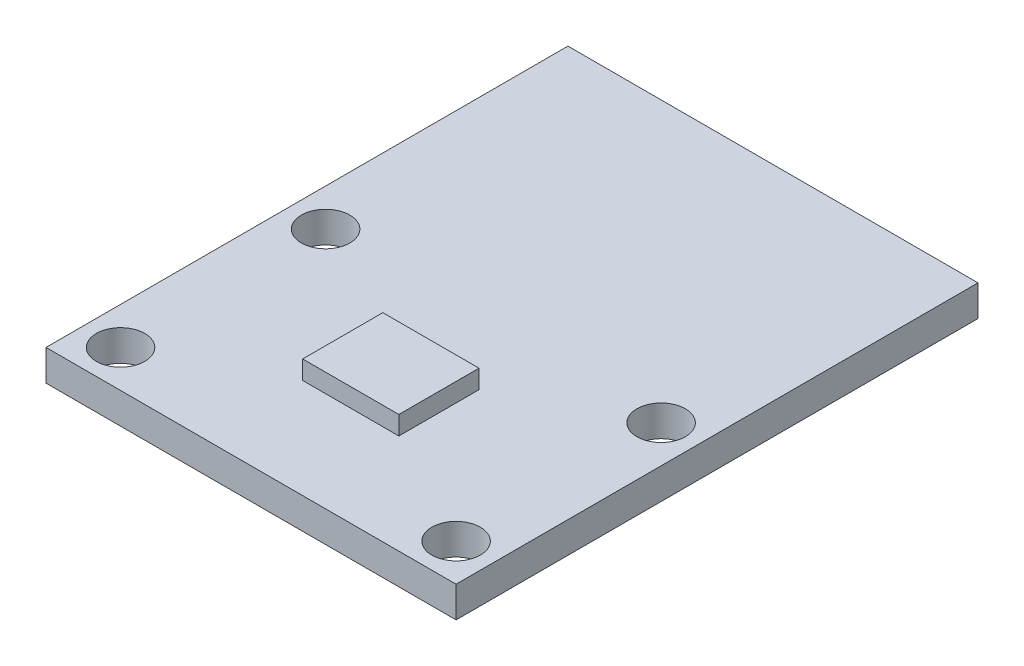
ISO-10303-21;
HEADER;
FILE_DESCRIPTION(('STEP AP214'),'2;1');
FILE_NAME('part.step','',(''),(''),'','','');
FILE_SCHEMA(('AUTOMOTIVE_DESIGN { 1 0 10303 214 1 1 1 1 }'));
ENDSEC;
DATA;
#1=APPLICATION_CONTEXT('core data for automotive mechanical design processes');
#2=APPLICATION_PROTOCOL_DEFINITION('international standard','automotive_design',2000,#1);
#3=PRODUCT_CONTEXT('',#1,'mechanical');
#4=PRODUCT('Part','Part','',(#3));
#5=PRODUCT_RELATED_PRODUCT_CATEGORY('part','',(#4));
#6=PRODUCT_DEFINITION_FORMATION('','',#4);
#7=PRODUCT_DEFINITION_CONTEXT('part definition',#1,'design');
#8=PRODUCT_DEFINITION('design','',#6,#7);
#9=PRODUCT_DEFINITION_SHAPE('','',#8);
#10=(LENGTH_UNIT() NAMED_UNIT(*) SI_UNIT(.MILLI.,.METRE.));
#11=(NAMED_UNIT(*) PLANE_ANGLE_UNIT() SI_UNIT($,.RADIAN.));
#12=(NAMED_UNIT(*) SI_UNIT($,.STERADIAN.) SOLID_ANGLE_UNIT());
#13=UNCERTAINTY_MEASURE_WITH_UNIT(LENGTH_MEASURE(1.E-05),#10,'distance_accuracy_value','');
#14=(GEOMETRIC_REPRESENTATION_CONTEXT(3) GLOBAL_UNCERTAINTY_ASSIGNED_CONTEXT((#13)) GLOBAL_UNIT_ASSIGNED_CONTEXT((#10,
#11,#12)) REPRESENTATION_CONTEXT('',''));
#15=CARTESIAN_POINT('',(0.,0.,0.));
#16=DIRECTION('',(0.,0.,1.));
#17=DIRECTION('',(1.,0.,0.));
#18=AXIS2_PLACEMENT_3D('',#15,#16,#17);
#19=CARTESIAN_POINT('',(0.,0.83,0.));
#20=DIRECTION('',(0.,1.,0.));
#21=DIRECTION('',(0.,0.,1.));
#22=AXIS2_PLACEMENT_3D('',#19,#20,#21);
#23=PLANE('',#22);
#24=CARTESIAN_POINT('',(-8.99999999999999,0.83,12.));
#25=DIRECTION('',(0.,1.,0.));
#26=DIRECTION('',(0.,0.,1.));
#27=AXIS2_PLACEMENT_3D('',#24,#25,#26);
#28=CIRCLE('',#27,1.3);
#29=CARTESIAN_POINT('',(-8.99999999999999,0.83,10.7));
#30=VERTEX_POINT('',#29);
#31=EDGE_CURVE('E146',#30,#30,#28,.T.);
#32=ORIENTED_EDGE('',*,*,#31,.F.);
#33=EDGE_LOOP('',(#32));
#34=FACE_BOUND('',#33,.T.);
#35=CARTESIAN_POINT('',(-9.,0.83,1.));
#36=DIRECTION('',(0.,1.,0.));
#37=DIRECTION('',(0.,0.,1.));
#38=AXIS2_PLACEMENT_3D('',#35,#36,#37);
#39=CIRCLE('',#38,1.3);
#40=CARTESIAN_POINT('',(-9.,0.83,-0.299999999999995));
#41=VERTEX_POINT('',#40);
#42=EDGE_CURVE('E158',#41,#41,#39,.T.);
#43=ORIENTED_EDGE('',*,*,#42,.F.);
#44=EDGE_LOOP('',(#43));
#45=FACE_BOUND('',#44,.T.);
#46=DIRECTION('',(0.,0.,-1.));
#47=VECTOR('',#46,1.);
#48=CARTESIAN_POINT('',(11.,0.83,-14.));
#49=LINE('',#48,#47);
#50=CARTESIAN_POINT('',(11.,0.83,14.));
#51=VERTEX_POINT('',#50);
#52=CARTESIAN_POINT('',(11.,0.83,-14.));
#53=VERTEX_POINT('',#52);
#54=EDGE_CURVE('E164',#51,#53,#49,.T.);
#55=ORIENTED_EDGE('',*,*,#54,.T.);
#56=DIRECTION('',(-1.,0.,0.));
#57=VECTOR('',#56,1.);
#58=CARTESIAN_POINT('',(-11.,0.83,-14.));
#59=LINE('',#58,#57);
#60=CARTESIAN_POINT('',(-11.,0.83,-14.));
#61=VERTEX_POINT('',#60);
#62=EDGE_CURVE('E88',#53,#61,#59,.T.);
#63=ORIENTED_EDGE('',*,*,#62,.T.);
#64=DIRECTION('',(0.,0.,1.));
#65=VECTOR('',#64,1.);
#66=CARTESIAN_POINT('',(-11.,0.83,-14.));
#67=LINE('',#66,#65);
#68=CARTESIAN_POINT('',(-11.,0.83,14.));
#69=VERTEX_POINT('',#68);
#70=EDGE_CURVE('E167',#61,#69,#67,.T.);
#71=ORIENTED_EDGE('',*,*,#70,.T.);
#72=DIRECTION('',(1.,0.,0.));
#73=VECTOR('',#72,1.);
#74=CARTESIAN_POINT('',(-11.,0.83,14.));
#75=LINE('',#74,#73);
#76=EDGE_CURVE('E60',#69,#51,#75,.T.);
#77=ORIENTED_EDGE('',*,*,#76,.T.);
#78=EDGE_LOOP('',(#55,#63,#71,#77));
#79=FACE_BOUND('',#78,.T.);
#80=CARTESIAN_POINT('',(9.,0.83,1.));
#81=DIRECTION('',(0.,1.,0.));
#82=DIRECTION('',(0.,0.,1.));
#83=AXIS2_PLACEMENT_3D('',#80,#81,#82);
#84=CIRCLE('',#83,1.3);
#85=CARTESIAN_POINT('',(9.,0.83,-0.299999999999997));
#86=VERTEX_POINT('',#85);
#87=EDGE_CURVE('E152',#86,#86,#84,.T.);
#88=ORIENTED_EDGE('',*,*,#87,.F.);
#89=EDGE_LOOP('',(#88));
#90=FACE_BOUND('',#89,.T.);
#91=CARTESIAN_POINT('',(9.,0.83,12.));
#92=DIRECTION('',(0.,1.,0.));
#93=DIRECTION('',(0.,0.,1.));
#94=AXIS2_PLACEMENT_3D('',#91,#92,#93);
#95=CIRCLE('',#94,1.3);
#96=CARTESIAN_POINT('',(9.,0.83,10.7));
#97=VERTEX_POINT('',#96);
#98=EDGE_CURVE('E138',#97,#97,#95,.T.);
#99=ORIENTED_EDGE('',*,*,#98,.F.);
#100=EDGE_LOOP('',(#99));
#101=FACE_BOUND('',#100,.T.);
#102=DIRECTION('',(-1.,0.,0.));
#103=VECTOR('',#102,1.);
#104=CARTESIAN_POINT('',(-2.58,0.83,4.35));
#105=LINE('',#104,#103);
#106=CARTESIAN_POINT('',(2.58,0.83,4.35));
#107=VERTEX_POINT('',#106);
#108=CARTESIAN_POINT('',(-2.58,0.83,4.35));
#109=VERTEX_POINT('',#108);
#110=EDGE_CURVE('E357',#107,#109,#105,.T.);
#111=ORIENTED_EDGE('',*,*,#110,.F.);
#112=DIRECTION('',(0.,0.,-1.));
#113=VECTOR('',#112,1.);
#114=CARTESIAN_POINT('',(2.58,0.83,4.35));
#115=LINE('',#114,#113);
#116=CARTESIAN_POINT('',(2.58,0.83,8.65));
#117=VERTEX_POINT('',#116);
#118=EDGE_CURVE('E133',#117,#107,#115,.T.);
#119=ORIENTED_EDGE('',*,*,#118,.F.);
#120=DIRECTION('',(1.,0.,0.));
#121=VECTOR('',#120,1.);
#122=CARTESIAN_POINT('',(-2.58,0.83,8.65));
#123=LINE('',#122,#121);
#124=CARTESIAN_POINT('',(-2.58,0.83,8.65));
#125=VERTEX_POINT('',#124);
#126=EDGE_CURVE('E129',#125,#117,#123,.T.);
#127=ORIENTED_EDGE('',*,*,#126,.F.);
#128=DIRECTION('',(0.,0.,1.));
#129=VECTOR('',#128,1.);
#130=CARTESIAN_POINT('',(-2.58,0.83,4.35));
#131=LINE('',#130,#129);
#132=EDGE_CURVE('E354',#109,#125,#131,.T.);
#133=ORIENTED_EDGE('',*,*,#132,.F.);
#134=EDGE_LOOP('',(#111,#119,#127,#133));
#135=FACE_BOUND('',#134,.T.);
#136=ADVANCED_FACE('F36',(#34,#45,#79,#90,#101,#135),#23,.T.);
#137=CARTESIAN_POINT('',(0.,-0.83,0.));
#138=DIRECTION('',(0.,1.,0.));
#139=DIRECTION('',(0.,0.,1.));
#140=AXIS2_PLACEMENT_3D('',#137,#138,#139);
#141=PLANE('',#140);
#142=DIRECTION('',(0.,0.,-1.));
#143=VECTOR('',#142,1.);
#144=CARTESIAN_POINT('',(11.,-0.83,-14.));
#145=LINE('',#144,#143);
#146=CARTESIAN_POINT('',(11.,-0.83,14.));
#147=VERTEX_POINT('',#146);
#148=CARTESIAN_POINT('',(11.,-0.83,-14.));
#149=VERTEX_POINT('',#148);
#150=EDGE_CURVE('E161',#147,#149,#145,.T.);
#151=ORIENTED_EDGE('',*,*,#150,.F.);
#152=DIRECTION('',(1.,0.,0.));
#153=VECTOR('',#152,1.);
#154=CARTESIAN_POINT('',(-11.,-0.83,14.));
#155=LINE('',#154,#153);
#156=CARTESIAN_POINT('',(-11.,-0.83,14.));
#157=VERTEX_POINT('',#156);
#158=EDGE_CURVE('E81',#157,#147,#155,.T.);
#159=ORIENTED_EDGE('',*,*,#158,.F.);
#160=DIRECTION('',(0.,0.,1.));
#161=VECTOR('',#160,1.);
#162=CARTESIAN_POINT('',(-11.,-0.83,-14.));
#163=LINE('',#162,#161);
#164=CARTESIAN_POINT('',(-11.,-0.83,-14.));
#165=VERTEX_POINT('',#164);
#166=EDGE_CURVE('E175',#165,#157,#163,.T.);
#167=ORIENTED_EDGE('',*,*,#166,.F.);
#168=DIRECTION('',(-1.,0.,0.));
#169=VECTOR('',#168,1.);
#170=CARTESIAN_POINT('',(-11.,-0.83,-14.));
#171=LINE('',#170,#169);
#172=EDGE_CURVE('E173',#149,#165,#171,.T.);
#173=ORIENTED_EDGE('',*,*,#172,.F.);
#174=EDGE_LOOP('',(#151,#159,#167,#173));
#175=FACE_BOUND('',#174,.T.);
#176=CARTESIAN_POINT('',(-9.,-0.83,1.));
#177=DIRECTION('',(0.,1.,0.));
#178=DIRECTION('',(0.,0.,1.));
#179=AXIS2_PLACEMENT_3D('',#176,#177,#178);
#180=CIRCLE('',#179,1.3);
#181=CARTESIAN_POINT('',(-9.,-0.83,-0.299999999999995));
#182=VERTEX_POINT('',#181);
#183=EDGE_CURVE('E155',#182,#182,#180,.T.);
#184=ORIENTED_EDGE('',*,*,#183,.T.);
#185=EDGE_LOOP('',(#184));
#186=FACE_BOUND('',#185,.T.);
#187=CARTESIAN_POINT('',(9.,-0.83,1.));
#188=DIRECTION('',(0.,1.,0.));
#189=DIRECTION('',(0.,0.,1.));
#190=AXIS2_PLACEMENT_3D('',#187,#188,#189);
#191=CIRCLE('',#190,1.3);
#192=CARTESIAN_POINT('',(9.,-0.83,-0.299999999999997));
#193=VERTEX_POINT('',#192);
#194=EDGE_CURVE('E149',#193,#193,#191,.T.);
#195=ORIENTED_EDGE('',*,*,#194,.T.);
#196=EDGE_LOOP('',(#195));
#197=FACE_BOUND('',#196,.T.);
#198=CARTESIAN_POINT('',(-8.99999999999999,-0.83,12.));
#199=DIRECTION('',(0.,1.,0.));
#200=DIRECTION('',(0.,0.,1.));
#201=AXIS2_PLACEMENT_3D('',#198,#199,#200);
#202=CIRCLE('',#201,1.3);
#203=CARTESIAN_POINT('',(-8.99999999999999,-0.83,10.7));
#204=VERTEX_POINT('',#203);
#205=EDGE_CURVE('E144',#204,#204,#202,.T.);
#206=ORIENTED_EDGE('',*,*,#205,.T.);
#207=EDGE_LOOP('',(#206));
#208=FACE_BOUND('',#207,.T.);
#209=CARTESIAN_POINT('',(9.,-0.83,12.));
#210=DIRECTION('',(0.,1.,0.));
#211=DIRECTION('',(0.,0.,1.));
#212=AXIS2_PLACEMENT_3D('',#209,#210,#211);
#213=CIRCLE('',#212,1.3);
#214=CARTESIAN_POINT('',(9.,-0.83,10.7));
#215=VERTEX_POINT('',#214);
#216=EDGE_CURVE('E135',#215,#215,#213,.T.);
#217=ORIENTED_EDGE('',*,*,#216,.T.);
#218=EDGE_LOOP('',(#217));
#219=FACE_BOUND('',#218,.T.);
#220=ADVANCED_FACE('F188',(#175,#186,#197,#208,#219),#141,.F.);
#221=CARTESIAN_POINT('',(11.,0.83,-14.));
#222=DIRECTION('',(-1.,0.,0.));
#223=DIRECTION('',(0.,0.,1.));
#224=AXIS2_PLACEMENT_3D('',#221,#222,#223);
#225=PLANE('',#224);
#226=ORIENTED_EDGE('',*,*,#150,.T.);
#227=DIRECTION('',(0.,-1.,0.));
#228=VECTOR('',#227,1.);
#229=CARTESIAN_POINT('',(11.,0.83,-14.));
#230=LINE('',#229,#228);
#231=EDGE_CURVE('E11',#53,#149,#230,.T.);
#232=ORIENTED_EDGE('',*,*,#231,.F.);
#233=ORIENTED_EDGE('',*,*,#54,.F.);
#234=DIRECTION('',(0.,-1.,0.));
#235=VECTOR('',#234,1.);
#236=CARTESIAN_POINT('',(11.,0.83,14.));
#237=LINE('',#236,#235);
#238=EDGE_CURVE('E170',#51,#147,#237,.T.);
#239=ORIENTED_EDGE('',*,*,#238,.T.);
#240=EDGE_LOOP('',(#226,#232,#233,#239));
#241=FACE_BOUND('',#240,.T.);
#242=ADVANCED_FACE('F38',(#241),#225,.F.);
#243=CARTESIAN_POINT('',(-11.,0.83,-14.));
#244=DIRECTION('',(0.,0.,1.));
#245=DIRECTION('',(1.,0.,0.));
#246=AXIS2_PLACEMENT_3D('',#243,#244,#245);
#247=PLANE('',#246);
#248=ORIENTED_EDGE('',*,*,#172,.T.);
#249=DIRECTION('',(0.,-1.,0.));
#250=VECTOR('',#249,1.);
#251=CARTESIAN_POINT('',(-11.,0.83,-14.));
#252=LINE('',#251,#250);
#253=EDGE_CURVE('E44',#61,#165,#252,.T.);
#254=ORIENTED_EDGE('',*,*,#253,.F.);
#255=ORIENTED_EDGE('',*,*,#62,.F.);
#256=ORIENTED_EDGE('',*,*,#231,.T.);
#257=EDGE_LOOP('',(#248,#254,#255,#256));
#258=FACE_BOUND('',#257,.T.);
#259=ADVANCED_FACE('F204',(#258),#247,.F.);
#260=CARTESIAN_POINT('',(-11.,0.83,-14.));
#261=DIRECTION('',(1.,0.,0.));
#262=DIRECTION('',(0.,0.,-1.));
#263=AXIS2_PLACEMENT_3D('',#260,#261,#262);
#264=PLANE('',#263);
#265=ORIENTED_EDGE('',*,*,#166,.T.);
#266=DIRECTION('',(0.,-1.,0.));
#267=VECTOR('',#266,1.);
#268=CARTESIAN_POINT('',(-11.,0.83,14.));
#269=LINE('',#268,#267);
#270=EDGE_CURVE('E179',#69,#157,#269,.T.);
#271=ORIENTED_EDGE('',*,*,#270,.F.);
#272=ORIENTED_EDGE('',*,*,#70,.F.);
#273=ORIENTED_EDGE('',*,*,#253,.T.);
#274=EDGE_LOOP('',(#265,#271,#272,#273));
#275=FACE_BOUND('',#274,.T.);
#276=ADVANCED_FACE('F184',(#275),#264,.F.);
#277=CARTESIAN_POINT('',(-11.,0.83,14.));
#278=DIRECTION('',(0.,0.,-1.));
#279=DIRECTION('',(-1.,0.,0.));
#280=AXIS2_PLACEMENT_3D('',#277,#278,#279);
#281=PLANE('',#280);
#282=ORIENTED_EDGE('',*,*,#158,.T.);
#283=ORIENTED_EDGE('',*,*,#238,.F.);
#284=ORIENTED_EDGE('',*,*,#76,.F.);
#285=ORIENTED_EDGE('',*,*,#270,.T.);
#286=EDGE_LOOP('',(#282,#283,#284,#285));
#287=FACE_BOUND('',#286,.T.);
#288=ADVANCED_FACE('F193',(#287),#281,.F.);
#289=CARTESIAN_POINT('',(-9.,0.83,1.));
#290=DIRECTION('',(0.,-1.,0.));
#291=DIRECTION('',(0.,0.,-1.));
#292=AXIS2_PLACEMENT_3D('',#289,#290,#291);
#293=CYLINDRICAL_SURFACE('',#292,1.3);
#294=CARTESIAN_POINT('',(-9.,0.83,-0.299999999999995));
#295=CARTESIAN_POINT('',(-9.,0.812708333333333,-0.299999999999995));
#296=CARTESIAN_POINT('',(-9.,0.795416666666667,-0.299999999999995));
#297=CARTESIAN_POINT('',(-9.,0.760833333333333,-0.299999999999995));
#298=CARTESIAN_POINT('',(-9.,0.743541666666667,-0.299999999999995));
#299=CARTESIAN_POINT('',(-9.,0.708958333333333,-0.299999999999995));
#300=CARTESIAN_POINT('',(-9.,0.691666666666667,-0.299999999999995));
#301=CARTESIAN_POINT('',(-9.,0.657083333333333,-0.299999999999995));
#302=CARTESIAN_POINT('',(-9.,0.639791666666667,-0.299999999999995));
#303=CARTESIAN_POINT('',(-9.,0.605208333333333,-0.299999999999995));
#304=CARTESIAN_POINT('',(-9.,0.587916666666667,-0.299999999999995));
#305=CARTESIAN_POINT('',(-9.,0.553333333333333,-0.299999999999995));
#306=CARTESIAN_POINT('',(-9.,0.536041666666667,-0.299999999999995));
#307=CARTESIAN_POINT('',(-9.,0.501458333333333,-0.299999999999995));
#308=CARTESIAN_POINT('',(-9.,0.484166666666667,-0.299999999999995));
#309=CARTESIAN_POINT('',(-9.,0.449583333333333,-0.299999999999995));
#310=CARTESIAN_POINT('',(-9.,0.432291666666667,-0.299999999999995));
#311=CARTESIAN_POINT('',(-9.,0.397708333333333,-0.299999999999995));
#312=CARTESIAN_POINT('',(-9.,0.380416666666667,-0.299999999999995));
#313=CARTESIAN_POINT('',(-9.,0.345833333333333,-0.299999999999995));
#314=CARTESIAN_POINT('',(-9.,0.328541666666667,-0.299999999999995));
#315=CARTESIAN_POINT('',(-9.,0.293958333333333,-0.299999999999995));
#316=CARTESIAN_POINT('',(-9.,0.276666666666667,-0.299999999999995));
#317=CARTESIAN_POINT('',(-9.,0.242083333333333,-0.299999999999995));
#318=CARTESIAN_POINT('',(-9.,0.224791666666666,-0.299999999999995));
#319=CARTESIAN_POINT('',(-9.,0.190208333333333,-0.299999999999995));
#320=CARTESIAN_POINT('',(-9.,0.172916666666666,-0.299999999999995));
#321=CARTESIAN_POINT('',(-9.,0.138333333333333,-0.299999999999995));
#322=CARTESIAN_POINT('',(-9.,0.121041666666666,-0.299999999999995));
#323=CARTESIAN_POINT('',(-9.,0.0864583333333331,-0.299999999999995));
#324=CARTESIAN_POINT('',(-9.,0.0691666666666665,-0.299999999999995));
#325=CARTESIAN_POINT('',(-9.,0.0345833333333331,-0.299999999999995));
#326=CARTESIAN_POINT('',(-9.,0.0172916666666665,-0.299999999999995));
#327=CARTESIAN_POINT('',(-9.,-0.0172916666666669,-0.299999999999995));
#328=CARTESIAN_POINT('',(-9.,-0.0345833333333336,-0.299999999999995));
#329=CARTESIAN_POINT('',(-9.,-0.0691666666666669,-0.299999999999995));
#330=CARTESIAN_POINT('',(-9.,-0.0864583333333336,-0.299999999999995));
#331=CARTESIAN_POINT('',(-9.,-0.121041666666667,-0.299999999999995));
#332=CARTESIAN_POINT('',(-9.,-0.138333333333333,-0.299999999999995));
#333=CARTESIAN_POINT('',(-9.,-0.172916666666667,-0.299999999999995));
#334=CARTESIAN_POINT('',(-9.,-0.190208333333333,-0.299999999999995));
#335=CARTESIAN_POINT('',(-9.,-0.224791666666667,-0.299999999999995));
#336=CARTESIAN_POINT('',(-9.,-0.242083333333333,-0.299999999999995));
#337=CARTESIAN_POINT('',(-9.,-0.276666666666667,-0.299999999999995));
#338=CARTESIAN_POINT('',(-9.,-0.293958333333333,-0.299999999999995));
#339=CARTESIAN_POINT('',(-9.,-0.328541666666667,-0.299999999999995));
#340=CARTESIAN_POINT('',(-9.,-0.345833333333333,-0.299999999999995));
#341=CARTESIAN_POINT('',(-9.,-0.380416666666667,-0.299999999999995));
#342=CARTESIAN_POINT('',(-9.,-0.397708333333333,-0.299999999999995));
#343=CARTESIAN_POINT('',(-9.,-0.432291666666667,-0.299999999999995));
#344=CARTESIAN_POINT('',(-9.,-0.449583333333333,-0.299999999999995));
#345=CARTESIAN_POINT('',(-9.,-0.484166666666667,-0.299999999999995));
#346=CARTESIAN_POINT('',(-9.,-0.501458333333333,-0.299999999999995));
#347=CARTESIAN_POINT('',(-9.,-0.536041666666667,-0.299999999999995));
#348=CARTESIAN_POINT('',(-9.,-0.553333333333334,-0.299999999999995));
#349=CARTESIAN_POINT('',(-9.,-0.587916666666667,-0.299999999999995));
#350=CARTESIAN_POINT('',(-9.,-0.605208333333334,-0.299999999999995));
#351=CARTESIAN_POINT('',(-9.,-0.639791666666667,-0.299999999999995));
#352=CARTESIAN_POINT('',(-9.,-0.657083333333334,-0.299999999999995));
#353=CARTESIAN_POINT('',(-9.,-0.691666666666667,-0.299999999999995));
#354=CARTESIAN_POINT('',(-9.,-0.708958333333333,-0.299999999999995));
#355=CARTESIAN_POINT('',(-9.,-0.743541666666667,-0.299999999999995));
#356=CARTESIAN_POINT('',(-9.,-0.760833333333333,-0.299999999999995));
#357=CARTESIAN_POINT('',(-9.,-0.795416666666667,-0.299999999999995));
#358=CARTESIAN_POINT('',(-9.,-0.812708333333334,-0.299999999999995));
#359=CARTESIAN_POINT('',(-9.,-0.83,-0.299999999999995));
#360=B_SPLINE_CURVE_WITH_KNOTS('',3,(#294,#295,#296,#297,#298,#299,#300,#301,#302,#303,#304,
#305,#306,#307,#308,#309,#310,#311,#312,#313,#314,#315,#316,#317,#318,#319,#320,#321,#322,#323,
#324,#325,#326,#327,#328,#329,#330,#331,#332,#333,#334,#335,#336,#337,#338,#339,#340,#341,#342,
#343,#344,#345,#346,#347,#348,#349,#350,#351,#352,#353,#354,#355,#356,#357,#358,#359),
.UNSPECIFIED.,.F.,.F.,(4,2,2,2,2,2,2,2,2,2,2,2,2,2,2,2,2,2,2,2,2,2,2,2,2,2,2,2,2,2,2,2,4),(0.,
0.0518749999999999,0.10375,0.155625,0.2075,0.259375,0.31125,0.363125,0.415,0.466875,0.51875,
0.570625,0.6225,0.674375,0.72625,0.778125,0.83,0.881875,0.93375,0.985625,1.0375,1.089375,
1.14125,1.193125,1.245,1.296875,1.34875,1.400625,1.4525,1.504375,1.55625,1.608125,1.66),.UNSPECIFIED.);
#361=EDGE_CURVE('BSEAM195',#41,#182,#360,.T.);
#362=ORIENTED_EDGE('',*,*,#42,.T.);
#363=ORIENTED_EDGE('',*,*,#183,.F.);
#364=ORIENTED_EDGE('',*,*,#361,.T.);
#365=ORIENTED_EDGE('',*,*,#361,.F.);
#366=EDGE_LOOP('',(#362,#364,#363,#365));
#367=FACE_BOUND('',#366,.T.);
#368=ADVANCED_FACE('F195',(#367),#293,.F.);
#369=CARTESIAN_POINT('',(9.,0.83,1.));
#370=DIRECTION('',(0.,-1.,0.));
#371=DIRECTION('',(0.,0.,-1.));
#372=AXIS2_PLACEMENT_3D('',#369,#370,#371);
#373=CYLINDRICAL_SURFACE('',#372,1.3);
#374=CARTESIAN_POINT('',(9.,0.83,-0.299999999999997));
#375=CARTESIAN_POINT('',(9.,0.812708333333333,-0.299999999999997));
#376=CARTESIAN_POINT('',(9.,0.795416666666667,-0.299999999999997));
#377=CARTESIAN_POINT('',(9.,0.760833333333333,-0.299999999999997));
#378=CARTESIAN_POINT('',(9.,0.743541666666667,-0.299999999999997));
#379=CARTESIAN_POINT('',(9.,0.708958333333333,-0.299999999999997));
#380=CARTESIAN_POINT('',(9.,0.691666666666667,-0.299999999999997));
#381=CARTESIAN_POINT('',(9.,0.657083333333333,-0.299999999999997));
#382=CARTESIAN_POINT('',(9.,0.639791666666667,-0.299999999999997));
#383=CARTESIAN_POINT('',(9.,0.605208333333333,-0.299999999999997));
#384=CARTESIAN_POINT('',(9.,0.587916666666667,-0.299999999999997));
#385=CARTESIAN_POINT('',(9.,0.553333333333333,-0.299999999999997));
#386=CARTESIAN_POINT('',(9.,0.536041666666667,-0.299999999999997));
#387=CARTESIAN_POINT('',(9.,0.501458333333333,-0.299999999999997));
#388=CARTESIAN_POINT('',(9.,0.484166666666667,-0.299999999999997));
#389=CARTESIAN_POINT('',(9.,0.449583333333333,-0.299999999999997));
#390=CARTESIAN_POINT('',(9.,0.432291666666667,-0.299999999999997));
#391=CARTESIAN_POINT('',(9.,0.397708333333333,-0.299999999999997));
#392=CARTESIAN_POINT('',(9.,0.380416666666667,-0.299999999999997));
#393=CARTESIAN_POINT('',(9.,0.345833333333333,-0.299999999999997));
#394=CARTESIAN_POINT('',(9.,0.328541666666667,-0.299999999999997));
#395=CARTESIAN_POINT('',(9.,0.293958333333333,-0.299999999999997));
#396=CARTESIAN_POINT('',(9.,0.276666666666667,-0.299999999999997));
#397=CARTESIAN_POINT('',(9.,0.242083333333333,-0.299999999999997));
#398=CARTESIAN_POINT('',(9.,0.224791666666666,-0.299999999999997));
#399=CARTESIAN_POINT('',(9.,0.190208333333333,-0.299999999999997));
#400=CARTESIAN_POINT('',(9.,0.172916666666666,-0.299999999999997));
#401=CARTESIAN_POINT('',(9.,0.138333333333333,-0.299999999999997));
#402=CARTESIAN_POINT('',(9.,0.121041666666666,-0.299999999999997));
#403=CARTESIAN_POINT('',(9.,0.0864583333333331,-0.299999999999997));
#404=CARTESIAN_POINT('',(9.,0.0691666666666665,-0.299999999999997));
#405=CARTESIAN_POINT('',(9.,0.0345833333333331,-0.299999999999997));
#406=CARTESIAN_POINT('',(9.,0.0172916666666665,-0.299999999999997));
#407=CARTESIAN_POINT('',(9.,-0.0172916666666669,-0.299999999999997));
#408=CARTESIAN_POINT('',(9.,-0.0345833333333336,-0.299999999999997));
#409=CARTESIAN_POINT('',(9.,-0.0691666666666669,-0.299999999999997));
#410=CARTESIAN_POINT('',(9.,-0.0864583333333336,-0.299999999999997));
#411=CARTESIAN_POINT('',(9.,-0.121041666666667,-0.299999999999997));
#412=CARTESIAN_POINT('',(9.,-0.138333333333333,-0.299999999999997));
#413=CARTESIAN_POINT('',(9.,-0.172916666666667,-0.299999999999997));
#414=CARTESIAN_POINT('',(9.,-0.190208333333333,-0.299999999999997));
#415=CARTESIAN_POINT('',(9.,-0.224791666666667,-0.299999999999997));
#416=CARTESIAN_POINT('',(9.,-0.242083333333333,-0.299999999999997));
#417=CARTESIAN_POINT('',(9.,-0.276666666666667,-0.299999999999997));
#418=CARTESIAN_POINT('',(9.,-0.293958333333333,-0.299999999999997));
#419=CARTESIAN_POINT('',(9.,-0.328541666666667,-0.299999999999997));
#420=CARTESIAN_POINT('',(9.,-0.345833333333333,-0.299999999999997));
#421=CARTESIAN_POINT('',(9.,-0.380416666666667,-0.299999999999997));
#422=CARTESIAN_POINT('',(9.,-0.397708333333333,-0.299999999999997));
#423=CARTESIAN_POINT('',(9.,-0.432291666666667,-0.299999999999997));
#424=CARTESIAN_POINT('',(9.,-0.449583333333333,-0.299999999999997));
#425=CARTESIAN_POINT('',(9.,-0.484166666666667,-0.299999999999997));
#426=CARTESIAN_POINT('',(9.,-0.501458333333333,-0.299999999999997));
#427=CARTESIAN_POINT('',(9.,-0.536041666666667,-0.299999999999997));
#428=CARTESIAN_POINT('',(9.,-0.553333333333334,-0.299999999999997));
#429=CARTESIAN_POINT('',(9.,-0.587916666666667,-0.299999999999997));
#430=CARTESIAN_POINT('',(9.,-0.605208333333334,-0.299999999999997));
#431=CARTESIAN_POINT('',(9.,-0.639791666666667,-0.299999999999997));
#432=CARTESIAN_POINT('',(9.,-0.657083333333334,-0.299999999999997));
#433=CARTESIAN_POINT('',(9.,-0.691666666666667,-0.299999999999997));
#434=CARTESIAN_POINT('',(9.,-0.708958333333333,-0.299999999999997));
#435=CARTESIAN_POINT('',(9.,-0.743541666666667,-0.299999999999997));
#436=CARTESIAN_POINT('',(9.,-0.760833333333333,-0.299999999999997));
#437=CARTESIAN_POINT('',(9.,-0.795416666666667,-0.299999999999997));
#438=CARTESIAN_POINT('',(9.,-0.812708333333334,-0.299999999999997));
#439=CARTESIAN_POINT('',(9.,-0.83,-0.299999999999997));
#440=B_SPLINE_CURVE_WITH_KNOTS('',3,(#374,#375,#376,#377,#378,#379,#380,#381,#382,#383,#384,
#385,#386,#387,#388,#389,#390,#391,#392,#393,#394,#395,#396,#397,#398,#399,#400,#401,#402,#403,
#404,#405,#406,#407,#408,#409,#410,#411,#412,#413,#414,#415,#416,#417,#418,#419,#420,#421,#422,
#423,#424,#425,#426,#427,#428,#429,#430,#431,#432,#433,#434,#435,#436,#437,#438,#439),
.UNSPECIFIED.,.F.,.F.,(4,2,2,2,2,2,2,2,2,2,2,2,2,2,2,2,2,2,2,2,2,2,2,2,2,2,2,2,2,2,2,2,4),(0.,
0.0518749999999999,0.10375,0.155625,0.2075,0.259375,0.31125,0.363125,0.415,0.466875,0.51875,
0.570625,0.6225,0.674375,0.72625,0.778125,0.83,0.881875,0.93375,0.985625,1.0375,1.089375,
1.14125,1.193125,1.245,1.296875,1.34875,1.400625,1.4525,1.504375,1.55625,1.608125,1.66),.UNSPECIFIED.);
#441=EDGE_CURVE('BSEAM201',#86,#193,#440,.T.);
#442=ORIENTED_EDGE('',*,*,#87,.T.);
#443=ORIENTED_EDGE('',*,*,#194,.F.);
#444=ORIENTED_EDGE('',*,*,#441,.T.);
#445=ORIENTED_EDGE('',*,*,#441,.F.);
#446=EDGE_LOOP('',(#442,#444,#443,#445));
#447=FACE_BOUND('',#446,.T.);
#448=ADVANCED_FACE('F201',(#447),#373,.F.);
#449=CARTESIAN_POINT('',(-8.99999999999999,0.83,12.));
#450=DIRECTION('',(0.,-1.,0.));
#451=DIRECTION('',(0.,0.,-1.));
#452=AXIS2_PLACEMENT_3D('',#449,#450,#451);
#453=CYLINDRICAL_SURFACE('',#452,1.3);
#454=CARTESIAN_POINT('',(-8.99999999999999,0.83,10.7));
#455=CARTESIAN_POINT('',(-8.99999999999999,0.812708333333333,10.7));
#456=CARTESIAN_POINT('',(-8.99999999999999,0.795416666666667,10.7));
#457=CARTESIAN_POINT('',(-8.99999999999999,0.760833333333333,10.7));
#458=CARTESIAN_POINT('',(-8.99999999999999,0.743541666666667,10.7));
#459=CARTESIAN_POINT('',(-8.99999999999999,0.708958333333333,10.7));
#460=CARTESIAN_POINT('',(-8.99999999999999,0.691666666666667,10.7));
#461=CARTESIAN_POINT('',(-8.99999999999999,0.657083333333333,10.7));
#462=CARTESIAN_POINT('',(-8.99999999999999,0.639791666666667,10.7));
#463=CARTESIAN_POINT('',(-8.99999999999999,0.605208333333333,10.7));
#464=CARTESIAN_POINT('',(-8.99999999999999,0.587916666666667,10.7));
#465=CARTESIAN_POINT('',(-8.99999999999999,0.553333333333333,10.7));
#466=CARTESIAN_POINT('',(-8.99999999999999,0.536041666666667,10.7));
#467=CARTESIAN_POINT('',(-8.99999999999999,0.501458333333333,10.7));
#468=CARTESIAN_POINT('',(-8.99999999999999,0.484166666666667,10.7));
#469=CARTESIAN_POINT('',(-8.99999999999999,0.449583333333333,10.7));
#470=CARTESIAN_POINT('',(-8.99999999999999,0.432291666666667,10.7));
#471=CARTESIAN_POINT('',(-8.99999999999999,0.397708333333333,10.7));
#472=CARTESIAN_POINT('',(-8.99999999999999,0.380416666666667,10.7));
#473=CARTESIAN_POINT('',(-8.99999999999999,0.345833333333333,10.7));
#474=CARTESIAN_POINT('',(-8.99999999999999,0.328541666666667,10.7));
#475=CARTESIAN_POINT('',(-8.99999999999999,0.293958333333333,10.7));
#476=CARTESIAN_POINT('',(-8.99999999999999,0.276666666666667,10.7));
#477=CARTESIAN_POINT('',(-8.99999999999999,0.242083333333333,10.7));
#478=CARTESIAN_POINT('',(-8.99999999999999,0.224791666666666,10.7));
#479=CARTESIAN_POINT('',(-8.99999999999999,0.190208333333333,10.7));
#480=CARTESIAN_POINT('',(-8.99999999999999,0.172916666666666,10.7));
#481=CARTESIAN_POINT('',(-8.99999999999999,0.138333333333333,10.7));
#482=CARTESIAN_POINT('',(-8.99999999999999,0.121041666666666,10.7));
#483=CARTESIAN_POINT('',(-8.99999999999999,0.0864583333333331,10.7));
#484=CARTESIAN_POINT('',(-8.99999999999999,0.0691666666666665,10.7));
#485=CARTESIAN_POINT('',(-8.99999999999999,0.0345833333333331,10.7));
#486=CARTESIAN_POINT('',(-8.99999999999999,0.0172916666666665,10.7));
#487=CARTESIAN_POINT('',(-8.99999999999999,-0.0172916666666669,10.7));
#488=CARTESIAN_POINT('',(-8.99999999999999,-0.0345833333333336,10.7));
#489=CARTESIAN_POINT('',(-8.99999999999999,-0.0691666666666669,10.7));
#490=CARTESIAN_POINT('',(-8.99999999999999,-0.0864583333333336,10.7));
#491=CARTESIAN_POINT('',(-8.99999999999999,-0.121041666666667,10.7));
#492=CARTESIAN_POINT('',(-8.99999999999999,-0.138333333333333,10.7));
#493=CARTESIAN_POINT('',(-8.99999999999999,-0.172916666666667,10.7));
#494=CARTESIAN_POINT('',(-8.99999999999999,-0.190208333333333,10.7));
#495=CARTESIAN_POINT('',(-8.99999999999999,-0.224791666666667,10.7));
#496=CARTESIAN_POINT('',(-8.99999999999999,-0.242083333333333,10.7));
#497=CARTESIAN_POINT('',(-8.99999999999999,-0.276666666666667,10.7));
#498=CARTESIAN_POINT('',(-8.99999999999999,-0.293958333333333,10.7));
#499=CARTESIAN_POINT('',(-8.99999999999999,-0.328541666666667,10.7));
#500=CARTESIAN_POINT('',(-8.99999999999999,-0.345833333333333,10.7));
#501=CARTESIAN_POINT('',(-8.99999999999999,-0.380416666666667,10.7));
#502=CARTESIAN_POINT('',(-8.99999999999999,-0.397708333333333,10.7));
#503=CARTESIAN_POINT('',(-8.99999999999999,-0.432291666666667,10.7));
#504=CARTESIAN_POINT('',(-8.99999999999999,-0.449583333333333,10.7));
#505=CARTESIAN_POINT('',(-8.99999999999999,-0.484166666666667,10.7));
#506=CARTESIAN_POINT('',(-8.99999999999999,-0.501458333333333,10.7));
#507=CARTESIAN_POINT('',(-8.99999999999999,-0.536041666666667,10.7));
#508=CARTESIAN_POINT('',(-8.99999999999999,-0.553333333333334,10.7));
#509=CARTESIAN_POINT('',(-8.99999999999999,-0.587916666666667,10.7));
#510=CARTESIAN_POINT('',(-8.99999999999999,-0.605208333333334,10.7));
#511=CARTESIAN_POINT('',(-8.99999999999999,-0.639791666666667,10.7));
#512=CARTESIAN_POINT('',(-8.99999999999999,-0.657083333333334,10.7));
#513=CARTESIAN_POINT('',(-8.99999999999999,-0.691666666666667,10.7));
#514=CARTESIAN_POINT('',(-8.99999999999999,-0.708958333333333,10.7));
#515=CARTESIAN_POINT('',(-8.99999999999999,-0.743541666666667,10.7));
#516=CARTESIAN_POINT('',(-8.99999999999999,-0.760833333333333,10.7));
#517=CARTESIAN_POINT('',(-8.99999999999999,-0.795416666666667,10.7));
#518=CARTESIAN_POINT('',(-8.99999999999999,-0.812708333333334,10.7));
#519=CARTESIAN_POINT('',(-8.99999999999999,-0.83,10.7));
#520=B_SPLINE_CURVE_WITH_KNOTS('',3,(#454,#455,#456,#457,#458,#459,#460,#461,#462,#463,#464,
#465,#466,#467,#468,#469,#470,#471,#472,#473,#474,#475,#476,#477,#478,#479,#480,#481,#482,#483,
#484,#485,#486,#487,#488,#489,#490,#491,#492,#493,#494,#495,#496,#497,#498,#499,#500,#501,#502,
#503,#504,#505,#506,#507,#508,#509,#510,#511,#512,#513,#514,#515,#516,#517,#518,#519),
.UNSPECIFIED.,.F.,.F.,(4,2,2,2,2,2,2,2,2,2,2,2,2,2,2,2,2,2,2,2,2,2,2,2,2,2,2,2,2,2,2,2,4),(0.,
0.0518749999999999,0.10375,0.155625,0.2075,0.259375,0.31125,0.363125,0.415,0.466875,0.51875,
0.570625,0.6225,0.674375,0.72625,0.778125,0.83,0.881875,0.93375,0.985625,1.0375,1.089375,
1.14125,1.193125,1.245,1.296875,1.34875,1.400625,1.4525,1.504375,1.55625,1.608125,1.66),.UNSPECIFIED.);
#521=EDGE_CURVE('BSEAM218',#30,#204,#520,.T.);
#522=ORIENTED_EDGE('',*,*,#31,.T.);
#523=ORIENTED_EDGE('',*,*,#205,.F.);
#524=ORIENTED_EDGE('',*,*,#521,.T.);
#525=ORIENTED_EDGE('',*,*,#521,.F.);
#526=EDGE_LOOP('',(#522,#524,#523,#525));
#527=FACE_BOUND('',#526,.T.);
#528=ADVANCED_FACE('F218',(#527),#453,.F.);
#529=CARTESIAN_POINT('',(9.,0.83,12.));
#530=DIRECTION('',(0.,-1.,0.));
#531=DIRECTION('',(0.,0.,-1.));
#532=AXIS2_PLACEMENT_3D('',#529,#530,#531);
#533=CYLINDRICAL_SURFACE('',#532,1.3);
#534=CARTESIAN_POINT('',(9.,0.83,10.7));
#535=CARTESIAN_POINT('',(9.,0.812708333333333,10.7));
#536=CARTESIAN_POINT('',(9.,0.795416666666667,10.7));
#537=CARTESIAN_POINT('',(9.,0.760833333333333,10.7));
#538=CARTESIAN_POINT('',(9.,0.743541666666667,10.7));
#539=CARTESIAN_POINT('',(9.,0.708958333333333,10.7));
#540=CARTESIAN_POINT('',(9.,0.691666666666667,10.7));
#541=CARTESIAN_POINT('',(9.,0.657083333333333,10.7));
#542=CARTESIAN_POINT('',(9.,0.639791666666667,10.7));
#543=CARTESIAN_POINT('',(9.,0.605208333333333,10.7));
#544=CARTESIAN_POINT('',(9.,0.587916666666667,10.7));
#545=CARTESIAN_POINT('',(9.,0.553333333333333,10.7));
#546=CARTESIAN_POINT('',(9.,0.536041666666667,10.7));
#547=CARTESIAN_POINT('',(9.,0.501458333333333,10.7));
#548=CARTESIAN_POINT('',(9.,0.484166666666667,10.7));
#549=CARTESIAN_POINT('',(9.,0.449583333333333,10.7));
#550=CARTESIAN_POINT('',(9.,0.432291666666667,10.7));
#551=CARTESIAN_POINT('',(9.,0.397708333333333,10.7));
#552=CARTESIAN_POINT('',(9.,0.380416666666667,10.7));
#553=CARTESIAN_POINT('',(9.,0.345833333333333,10.7));
#554=CARTESIAN_POINT('',(9.,0.328541666666667,10.7));
#555=CARTESIAN_POINT('',(9.,0.293958333333333,10.7));
#556=CARTESIAN_POINT('',(9.,0.276666666666667,10.7));
#557=CARTESIAN_POINT('',(9.,0.242083333333333,10.7));
#558=CARTESIAN_POINT('',(9.,0.224791666666666,10.7));
#559=CARTESIAN_POINT('',(9.,0.190208333333333,10.7));
#560=CARTESIAN_POINT('',(9.,0.172916666666666,10.7));
#561=CARTESIAN_POINT('',(9.,0.138333333333333,10.7));
#562=CARTESIAN_POINT('',(9.,0.121041666666666,10.7));
#563=CARTESIAN_POINT('',(9.,0.0864583333333331,10.7));
#564=CARTESIAN_POINT('',(9.,0.0691666666666665,10.7));
#565=CARTESIAN_POINT('',(9.,0.0345833333333331,10.7));
#566=CARTESIAN_POINT('',(9.,0.0172916666666665,10.7));
#567=CARTESIAN_POINT('',(9.,-0.0172916666666669,10.7));
#568=CARTESIAN_POINT('',(9.,-0.0345833333333336,10.7));
#569=CARTESIAN_POINT('',(9.,-0.0691666666666669,10.7));
#570=CARTESIAN_POINT('',(9.,-0.0864583333333336,10.7));
#571=CARTESIAN_POINT('',(9.,-0.121041666666667,10.7));
#572=CARTESIAN_POINT('',(9.,-0.138333333333333,10.7));
#573=CARTESIAN_POINT('',(9.,-0.172916666666667,10.7));
#574=CARTESIAN_POINT('',(9.,-0.190208333333333,10.7));
#575=CARTESIAN_POINT('',(9.,-0.224791666666667,10.7));
#576=CARTESIAN_POINT('',(9.,-0.242083333333333,10.7));
#577=CARTESIAN_POINT('',(9.,-0.276666666666667,10.7));
#578=CARTESIAN_POINT('',(9.,-0.293958333333333,10.7));
#579=CARTESIAN_POINT('',(9.,-0.328541666666667,10.7));
#580=CARTESIAN_POINT('',(9.,-0.345833333333333,10.7));
#581=CARTESIAN_POINT('',(9.,-0.380416666666667,10.7));
#582=CARTESIAN_POINT('',(9.,-0.397708333333333,10.7));
#583=CARTESIAN_POINT('',(9.,-0.432291666666667,10.7));
#584=CARTESIAN_POINT('',(9.,-0.449583333333333,10.7));
#585=CARTESIAN_POINT('',(9.,-0.484166666666667,10.7));
#586=CARTESIAN_POINT('',(9.,-0.501458333333333,10.7));
#587=CARTESIAN_POINT('',(9.,-0.536041666666667,10.7));
#588=CARTESIAN_POINT('',(9.,-0.553333333333334,10.7));
#589=CARTESIAN_POINT('',(9.,-0.587916666666667,10.7));
#590=CARTESIAN_POINT('',(9.,-0.605208333333334,10.7));
#591=CARTESIAN_POINT('',(9.,-0.639791666666667,10.7));
#592=CARTESIAN_POINT('',(9.,-0.657083333333334,10.7));
#593=CARTESIAN_POINT('',(9.,-0.691666666666667,10.7));
#594=CARTESIAN_POINT('',(9.,-0.708958333333333,10.7));
#595=CARTESIAN_POINT('',(9.,-0.743541666666667,10.7));
#596=CARTESIAN_POINT('',(9.,-0.760833333333333,10.7));
#597=CARTESIAN_POINT('',(9.,-0.795416666666667,10.7));
#598=CARTESIAN_POINT('',(9.,-0.812708333333334,10.7));
#599=CARTESIAN_POINT('',(9.,-0.83,10.7));
#600=B_SPLINE_CURVE_WITH_KNOTS('',3,(#534,#535,#536,#537,#538,#539,#540,#541,#542,#543,#544,
#545,#546,#547,#548,#549,#550,#551,#552,#553,#554,#555,#556,#557,#558,#559,#560,#561,#562,#563,
#564,#565,#566,#567,#568,#569,#570,#571,#572,#573,#574,#575,#576,#577,#578,#579,#580,#581,#582,
#583,#584,#585,#586,#587,#588,#589,#590,#591,#592,#593,#594,#595,#596,#597,#598,#599),
.UNSPECIFIED.,.F.,.F.,(4,2,2,2,2,2,2,2,2,2,2,2,2,2,2,2,2,2,2,2,2,2,2,2,2,2,2,2,2,2,2,2,4),(0.,
0.0518749999999999,0.10375,0.155625,0.2075,0.259375,0.31125,0.363125,0.415,0.466875,0.51875,
0.570625,0.6225,0.674375,0.72625,0.778125,0.83,0.881875,0.93375,0.985625,1.0375,1.089375,
1.14125,1.193125,1.245,1.296875,1.34875,1.400625,1.4525,1.504375,1.55625,1.608125,1.66),.UNSPECIFIED.);
#601=EDGE_CURVE('BSEAM222',#97,#215,#600,.T.);
#602=ORIENTED_EDGE('',*,*,#98,.T.);
#603=ORIENTED_EDGE('',*,*,#216,.F.);
#604=ORIENTED_EDGE('',*,*,#601,.T.);
#605=ORIENTED_EDGE('',*,*,#601,.F.);
#606=EDGE_LOOP('',(#602,#604,#603,#605));
#607=FACE_BOUND('',#606,.T.);
#608=ADVANCED_FACE('F222',(#607),#533,.F.);
#609=CARTESIAN_POINT('',(2.58,1.83,4.35));
#610=DIRECTION('',(-1.,0.,0.));
#611=DIRECTION('',(0.,0.,1.));
#612=AXIS2_PLACEMENT_3D('',#609,#610,#611);
#613=PLANE('',#612);
#614=ORIENTED_EDGE('',*,*,#118,.T.);
#615=DIRECTION('',(0.,-1.,0.));
#616=VECTOR('',#615,1.);
#617=CARTESIAN_POINT('',(2.58,1.83,4.35));
#618=LINE('',#617,#616);
#619=CARTESIAN_POINT('',(2.58,1.83,4.35));
#620=VERTEX_POINT('',#619);
#621=EDGE_CURVE('E114',#620,#107,#618,.T.);
#622=ORIENTED_EDGE('',*,*,#621,.F.);
#623=DIRECTION('',(0.,0.,-1.));
#624=VECTOR('',#623,1.);
#625=CARTESIAN_POINT('',(2.58,1.83,4.35));
#626=LINE('',#625,#624);
#627=CARTESIAN_POINT('',(2.58,1.83,8.65));
#628=VERTEX_POINT('',#627);
#629=EDGE_CURVE('E121',#628,#620,#626,.T.);
#630=ORIENTED_EDGE('',*,*,#629,.F.);
#631=DIRECTION('',(0.,-1.,0.));
#632=VECTOR('',#631,1.);
#633=CARTESIAN_POINT('',(2.58,1.83,8.65));
#634=LINE('',#633,#632);
#635=EDGE_CURVE('E351',#628,#117,#634,.T.);
#636=ORIENTED_EDGE('',*,*,#635,.T.);
#637=EDGE_LOOP('',(#614,#622,#630,#636));
#638=FACE_BOUND('',#637,.T.);
#639=ADVANCED_FACE('F131',(#638),#613,.F.);
#640=CARTESIAN_POINT('',(-2.58,1.83,4.35));
#641=DIRECTION('',(0.,0.,1.));
#642=DIRECTION('',(1.,0.,0.));
#643=AXIS2_PLACEMENT_3D('',#640,#641,#642);
#644=PLANE('',#643);
#645=ORIENTED_EDGE('',*,*,#110,.T.);
#646=DIRECTION('',(0.,-1.,0.));
#647=VECTOR('',#646,1.);
#648=CARTESIAN_POINT('',(-2.58,1.83,4.35));
#649=LINE('',#648,#647);
#650=CARTESIAN_POINT('',(-2.58,1.83,4.35));
#651=VERTEX_POINT('',#650);
#652=EDGE_CURVE('E117',#651,#109,#649,.T.);
#653=ORIENTED_EDGE('',*,*,#652,.F.);
#654=DIRECTION('',(-1.,0.,0.));
#655=VECTOR('',#654,1.);
#656=CARTESIAN_POINT('',(-2.58,1.83,4.35));
#657=LINE('',#656,#655);
#658=EDGE_CURVE('E110',#620,#651,#657,.T.);
#659=ORIENTED_EDGE('',*,*,#658,.F.);
#660=ORIENTED_EDGE('',*,*,#621,.T.);
#661=EDGE_LOOP('',(#645,#653,#659,#660));
#662=FACE_BOUND('',#661,.T.);
#663=ADVANCED_FACE('F112',(#662),#644,.F.);
#664=CARTESIAN_POINT('',(-2.58,1.83,4.35));
#665=DIRECTION('',(1.,0.,0.));
#666=DIRECTION('',(0.,0.,-1.));
#667=AXIS2_PLACEMENT_3D('',#664,#665,#666);
#668=PLANE('',#667);
#669=ORIENTED_EDGE('',*,*,#132,.T.);
#670=DIRECTION('',(0.,-1.,0.));
#671=VECTOR('',#670,1.);
#672=CARTESIAN_POINT('',(-2.58,1.83,8.65));
#673=LINE('',#672,#671);
#674=CARTESIAN_POINT('',(-2.58,1.83,8.65));
#675=VERTEX_POINT('',#674);
#676=EDGE_CURVE('E51',#675,#125,#673,.T.);
#677=ORIENTED_EDGE('',*,*,#676,.F.);
#678=DIRECTION('',(0.,0.,1.));
#679=VECTOR('',#678,1.);
#680=CARTESIAN_POINT('',(-2.58,1.83,4.35));
#681=LINE('',#680,#679);
#682=EDGE_CURVE('E120',#651,#675,#681,.T.);
#683=ORIENTED_EDGE('',*,*,#682,.F.);
#684=ORIENTED_EDGE('',*,*,#652,.T.);
#685=EDGE_LOOP('',(#669,#677,#683,#684));
#686=FACE_BOUND('',#685,.T.);
#687=ADVANCED_FACE('F231',(#686),#668,.F.);
#688=CARTESIAN_POINT('',(-2.58,1.83,8.65));
#689=DIRECTION('',(0.,0.,-1.));
#690=DIRECTION('',(-1.,0.,0.));
#691=AXIS2_PLACEMENT_3D('',#688,#689,#690);
#692=PLANE('',#691);
#693=ORIENTED_EDGE('',*,*,#126,.T.);
#694=ORIENTED_EDGE('',*,*,#635,.F.);
#695=DIRECTION('',(1.,0.,0.));
#696=VECTOR('',#695,1.);
#697=CARTESIAN_POINT('',(-2.58,1.83,8.65));
#698=LINE('',#697,#696);
#699=EDGE_CURVE('E125',#675,#628,#698,.T.);
#700=ORIENTED_EDGE('',*,*,#699,.F.);
#701=ORIENTED_EDGE('',*,*,#676,.T.);
#702=EDGE_LOOP('',(#693,#694,#700,#701));
#703=FACE_BOUND('',#702,.T.);
#704=ADVANCED_FACE('F234',(#703),#692,.F.);
#705=CARTESIAN_POINT('',(0.,1.83,0.));
#706=DIRECTION('',(0.,1.,0.));
#707=DIRECTION('',(0.,0.,1.));
#708=AXIS2_PLACEMENT_3D('',#705,#706,#707);
#709=PLANE('',#708);
#710=ORIENTED_EDGE('',*,*,#629,.T.);
#711=ORIENTED_EDGE('',*,*,#658,.T.);
#712=ORIENTED_EDGE('',*,*,#682,.T.);
#713=ORIENTED_EDGE('',*,*,#699,.T.);
#714=EDGE_LOOP('',(#710,#711,#712,#713));
#715=FACE_BOUND('',#714,.T.);
#716=ADVANCED_FACE('F124',(#715),#709,.T.);
#717=CLOSED_SHELL('',(#136,#220,#242,#259,#276,#288,#368,#448,#528,#608,#639,#663,#687,#704,#716));
#718=MANIFOLD_SOLID_BREP('B2',#717);
#719=ADVANCED_BREP_SHAPE_REPRESENTATION('',(#18,#718),#14);
#720=SHAPE_DEFINITION_REPRESENTATION(#9,#719);
ENDSEC;
END-ISO-10303-21;
